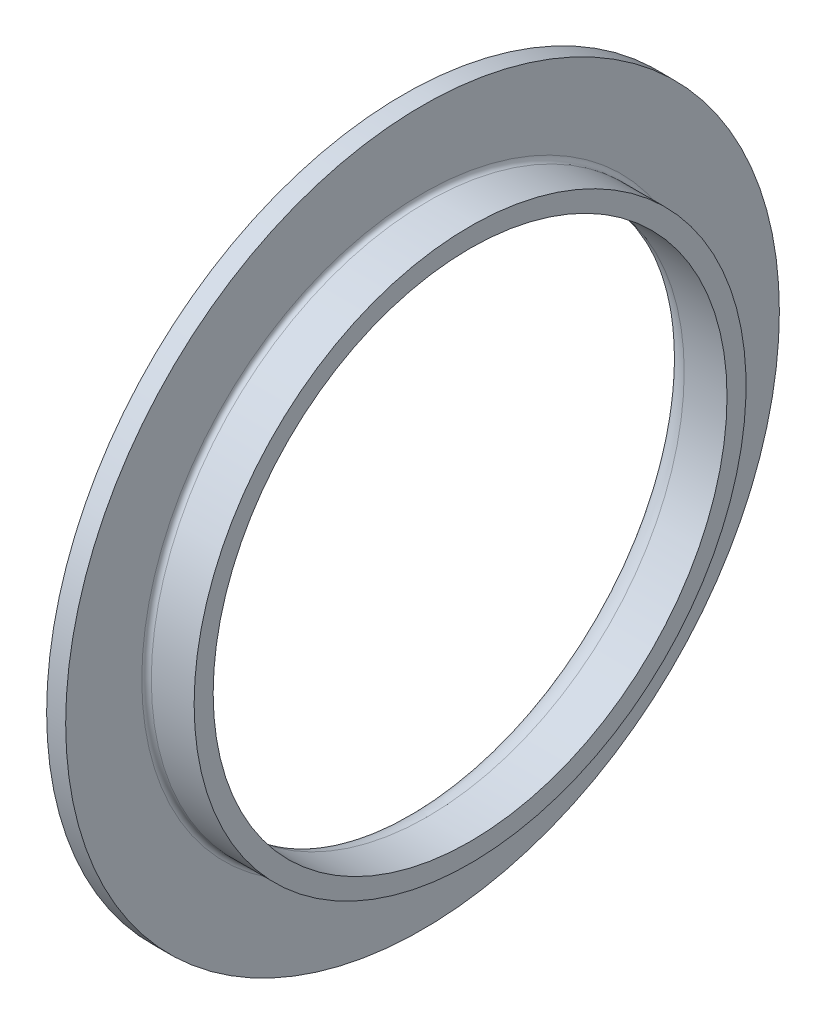
ISO-10303-21;
HEADER;
FILE_DESCRIPTION(('STEP AP214'),'2;1');
FILE_NAME('part.step','',(''),(''),'','','');
FILE_SCHEMA(('AUTOMOTIVE_DESIGN { 1 0 10303 214 1 1 1 1 }'));
ENDSEC;
DATA;
#1=APPLICATION_CONTEXT('core data for automotive mechanical design processes');
#2=APPLICATION_PROTOCOL_DEFINITION('international standard','automotive_design',2000,#1);
#3=PRODUCT_CONTEXT('',#1,'mechanical');
#4=PRODUCT('Part','Part','',(#3));
#5=PRODUCT_RELATED_PRODUCT_CATEGORY('part','',(#4));
#6=PRODUCT_DEFINITION_FORMATION('','',#4);
#7=PRODUCT_DEFINITION_CONTEXT('part definition',#1,'design');
#8=PRODUCT_DEFINITION('design','',#6,#7);
#9=PRODUCT_DEFINITION_SHAPE('','',#8);
#10=(LENGTH_UNIT() NAMED_UNIT(*) SI_UNIT(.MILLI.,.METRE.));
#11=(NAMED_UNIT(*) PLANE_ANGLE_UNIT() SI_UNIT($,.RADIAN.));
#12=(NAMED_UNIT(*) SI_UNIT($,.STERADIAN.) SOLID_ANGLE_UNIT());
#13=UNCERTAINTY_MEASURE_WITH_UNIT(LENGTH_MEASURE(1.E-05),#10,'distance_accuracy_value','');
#14=(GEOMETRIC_REPRESENTATION_CONTEXT(3) GLOBAL_UNCERTAINTY_ASSIGNED_CONTEXT((#13)) GLOBAL_UNIT_ASSIGNED_CONTEXT((#10,
#11,#12)) REPRESENTATION_CONTEXT('',''));
#15=CARTESIAN_POINT('',(0.,0.,0.));
#16=DIRECTION('',(0.,0.,1.));
#17=DIRECTION('',(1.,0.,0.));
#18=AXIS2_PLACEMENT_3D('',#15,#16,#17);
#19=CARTESIAN_POINT('',(0.,0.,0.));
#20=DIRECTION('',(-1.,0.,0.));
#21=DIRECTION('',(0.,0.,1.));
#22=AXIS2_PLACEMENT_3D('',#19,#20,#21);
#23=CYLINDRICAL_SURFACE('',#22,27.);
#24=CARTESIAN_POINT('',(7.,0.,0.));
#25=DIRECTION('',(-1.,0.,0.));
#26=DIRECTION('',(0.,0.,1.));
#27=AXIS2_PLACEMENT_3D('',#24,#25,#26);
#28=CIRCLE('',#27,27.);
#29=CARTESIAN_POINT('',(7.,0.,27.));
#30=VERTEX_POINT('',#29);
#31=EDGE_CURVE('E10',#30,#30,#28,.T.);
#32=ORIENTED_EDGE('',*,*,#31,.F.);
#33=EDGE_LOOP('',(#32));
#34=FACE_BOUND('',#33,.T.);
#35=CARTESIAN_POINT('',(2.50000000000002,0.,0.));
#36=DIRECTION('',(-1.,0.,0.));
#37=DIRECTION('',(0.,0.,1.));
#38=AXIS2_PLACEMENT_3D('',#35,#36,#37);
#39=CIRCLE('',#38,27.);
#40=CARTESIAN_POINT('',(2.50000000000002,0.,27.));
#41=VERTEX_POINT('',#40);
#42=EDGE_CURVE('E59',#41,#41,#39,.T.);
#43=ORIENTED_EDGE('',*,*,#42,.T.);
#44=EDGE_LOOP('',(#43));
#45=FACE_BOUND('',#44,.T.);
#46=ADVANCED_FACE('F31',(#34,#45),#23,.F.);
#47=CARTESIAN_POINT('',(7.,29.,0.));
#48=DIRECTION('',(1.,0.,0.));
#49=DIRECTION('',(0.,0.,-1.));
#50=AXIS2_PLACEMENT_3D('',#47,#48,#49);
#51=PLANE('',#50);
#52=ORIENTED_EDGE('',*,*,#31,.T.);
#53=EDGE_LOOP('',(#52));
#54=FACE_BOUND('',#53,.T.);
#55=CARTESIAN_POINT('',(7.,0.,0.));
#56=DIRECTION('',(-1.,0.,0.));
#57=DIRECTION('',(0.,0.,1.));
#58=AXIS2_PLACEMENT_3D('',#55,#56,#57);
#59=CIRCLE('',#58,29.);
#60=CARTESIAN_POINT('',(7.,0.,29.));
#61=VERTEX_POINT('',#60);
#62=EDGE_CURVE('E37',#61,#61,#59,.T.);
#63=ORIENTED_EDGE('',*,*,#62,.F.);
#64=EDGE_LOOP('',(#63));
#65=FACE_BOUND('',#64,.T.);
#66=ADVANCED_FACE('F88',(#54,#65),#51,.T.);
#67=CARTESIAN_POINT('',(0.,0.,0.));
#68=DIRECTION('',(-1.,0.,0.));
#69=DIRECTION('',(0.,0.,1.));
#70=AXIS2_PLACEMENT_3D('',#67,#68,#69);
#71=CYLINDRICAL_SURFACE('',#70,29.);
#72=ORIENTED_EDGE('',*,*,#62,.T.);
#73=EDGE_LOOP('',(#72));
#74=FACE_BOUND('',#73,.T.);
#75=CARTESIAN_POINT('',(2.50000000000002,0.,0.));
#76=DIRECTION('',(-1.,0.,0.));
#77=DIRECTION('',(0.,0.,1.));
#78=AXIS2_PLACEMENT_3D('',#75,#76,#77);
#79=CIRCLE('',#78,29.);
#80=CARTESIAN_POINT('',(2.50000000000002,0.,29.));
#81=VERTEX_POINT('',#80);
#82=EDGE_CURVE('E41',#81,#81,#79,.T.);
#83=ORIENTED_EDGE('',*,*,#82,.F.);
#84=EDGE_LOOP('',(#83));
#85=FACE_BOUND('',#84,.T.);
#86=ADVANCED_FACE('F93',(#74,#85),#71,.T.);
#87=CARTESIAN_POINT('',(2.5,0.,0.));
#88=DIRECTION('',(-1.,0.,0.));
#89=DIRECTION('',(0.,0.,1.));
#90=AXIS2_PLACEMENT_3D('',#87,#88,#89);
#91=TOROIDAL_SURFACE('',#90,29.5,0.499999999999999);
#92=ORIENTED_EDGE('',*,*,#82,.T.);
#93=EDGE_LOOP('',(#92));
#94=FACE_BOUND('',#93,.T.);
#95=CARTESIAN_POINT('',(2.,0.,0.));
#96=DIRECTION('',(-1.,0.,0.));
#97=DIRECTION('',(0.,0.,1.));
#98=AXIS2_PLACEMENT_3D('',#95,#96,#97);
#99=CIRCLE('',#98,29.5);
#100=CARTESIAN_POINT('',(2.,0.,29.5));
#101=VERTEX_POINT('',#100);
#102=EDGE_CURVE('E45',#101,#101,#99,.T.);
#103=ORIENTED_EDGE('',*,*,#102,.F.);
#104=EDGE_LOOP('',(#103));
#105=FACE_BOUND('',#104,.T.);
#106=ADVANCED_FACE('F84',(#94,#105),#91,.F.);
#107=CARTESIAN_POINT('',(2.,37.5,0.));
#108=DIRECTION('',(1.,0.,0.));
#109=DIRECTION('',(0.,0.,-1.));
#110=AXIS2_PLACEMENT_3D('',#107,#108,#109);
#111=PLANE('',#110);
#112=ORIENTED_EDGE('',*,*,#102,.T.);
#113=EDGE_LOOP('',(#112));
#114=FACE_BOUND('',#113,.T.);
#115=CARTESIAN_POINT('',(2.,0.,0.));
#116=DIRECTION('',(-1.,0.,0.));
#117=DIRECTION('',(0.,0.,1.));
#118=AXIS2_PLACEMENT_3D('',#115,#116,#117);
#119=CIRCLE('',#118,37.5);
#120=CARTESIAN_POINT('',(2.,0.,37.5));
#121=VERTEX_POINT('',#120);
#122=EDGE_CURVE('E50',#121,#121,#119,.T.);
#123=ORIENTED_EDGE('',*,*,#122,.F.);
#124=EDGE_LOOP('',(#123));
#125=FACE_BOUND('',#124,.T.);
#126=ADVANCED_FACE('F78',(#114,#125),#111,.T.);
#127=CARTESIAN_POINT('',(0.,0.,0.));
#128=DIRECTION('',(-1.,0.,0.));
#129=DIRECTION('',(0.,0.,1.));
#130=AXIS2_PLACEMENT_3D('',#127,#128,#129);
#131=CYLINDRICAL_SURFACE('',#130,37.5);
#132=ORIENTED_EDGE('',*,*,#122,.T.);
#133=EDGE_LOOP('',(#132));
#134=FACE_BOUND('',#133,.T.);
#135=CARTESIAN_POINT('',(0.,0.,0.));
#136=DIRECTION('',(-1.,0.,0.));
#137=DIRECTION('',(0.,0.,1.));
#138=AXIS2_PLACEMENT_3D('',#135,#136,#137);
#139=CIRCLE('',#138,37.5);
#140=CARTESIAN_POINT('',(0.,0.,37.5));
#141=VERTEX_POINT('',#140);
#142=EDGE_CURVE('E53',#141,#141,#139,.T.);
#143=ORIENTED_EDGE('',*,*,#142,.F.);
#144=EDGE_LOOP('',(#143));
#145=FACE_BOUND('',#144,.T.);
#146=ADVANCED_FACE('F73',(#134,#145),#131,.T.);
#147=CARTESIAN_POINT('',(0.,37.5,0.));
#148=DIRECTION('',(1.,0.,0.));
#149=DIRECTION('',(0.,0.,-1.));
#150=AXIS2_PLACEMENT_3D('',#147,#148,#149);
#151=PLANE('',#150);
#152=CARTESIAN_POINT('',(0.,0.,0.));
#153=DIRECTION('',(-1.,0.,0.));
#154=DIRECTION('',(0.,0.,1.));
#155=AXIS2_PLACEMENT_3D('',#152,#153,#154);
#156=CIRCLE('',#155,29.5);
#157=CARTESIAN_POINT('',(0.,0.,29.5));
#158=VERTEX_POINT('',#157);
#159=EDGE_CURVE('E56',#158,#158,#156,.T.);
#160=ORIENTED_EDGE('',*,*,#159,.F.);
#161=EDGE_LOOP('',(#160));
#162=FACE_BOUND('',#161,.T.);
#163=ORIENTED_EDGE('',*,*,#142,.T.);
#164=EDGE_LOOP('',(#163));
#165=FACE_BOUND('',#164,.T.);
#166=ADVANCED_FACE('F67',(#162,#165),#151,.F.);
#167=CARTESIAN_POINT('',(2.5,0.,0.));
#168=DIRECTION('',(-1.,0.,0.));
#169=DIRECTION('',(0.,0.,1.));
#170=AXIS2_PLACEMENT_3D('',#167,#168,#169);
#171=TOROIDAL_SURFACE('',#170,29.5,2.5);
#172=ORIENTED_EDGE('',*,*,#42,.F.);
#173=EDGE_LOOP('',(#172));
#174=FACE_BOUND('',#173,.T.);
#175=ORIENTED_EDGE('',*,*,#159,.T.);
#176=EDGE_LOOP('',(#175));
#177=FACE_BOUND('',#176,.T.);
#178=ADVANCED_FACE('F64',(#174,#177),#171,.T.);
#179=CLOSED_SHELL('',(#46,#66,#86,#106,#126,#146,#166,#178));
#180=MANIFOLD_SOLID_BREP('B2',#179);
#181=ADVANCED_BREP_SHAPE_REPRESENTATION('',(#18,#180),#14);
#182=SHAPE_DEFINITION_REPRESENTATION(#9,#181);
ENDSEC;
END-ISO-10303-21;
